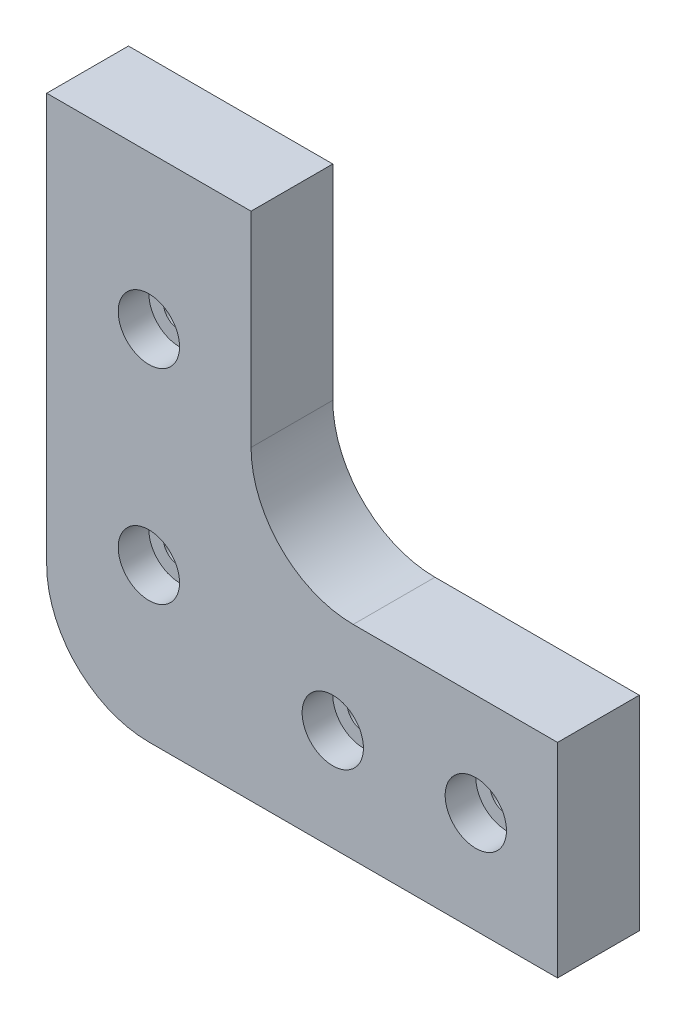
ISO-10303-21;
HEADER;
FILE_DESCRIPTION(('STEP AP214'),'2;1');
FILE_NAME('part.step','',(''),(''),'','','');
FILE_SCHEMA(('AUTOMOTIVE_DESIGN { 1 0 10303 214 1 1 1 1 }'));
ENDSEC;
DATA;
#1=APPLICATION_CONTEXT('core data for automotive mechanical design processes');
#2=APPLICATION_PROTOCOL_DEFINITION('international standard','automotive_design',2000,#1);
#3=PRODUCT_CONTEXT('',#1,'mechanical');
#4=PRODUCT('Part','Part','',(#3));
#5=PRODUCT_RELATED_PRODUCT_CATEGORY('part','',(#4));
#6=PRODUCT_DEFINITION_FORMATION('','',#4);
#7=PRODUCT_DEFINITION_CONTEXT('part definition',#1,'design');
#8=PRODUCT_DEFINITION('design','',#6,#7);
#9=PRODUCT_DEFINITION_SHAPE('','',#8);
#10=(LENGTH_UNIT() NAMED_UNIT(*) SI_UNIT(.MILLI.,.METRE.));
#11=(NAMED_UNIT(*) PLANE_ANGLE_UNIT() SI_UNIT($,.RADIAN.));
#12=(NAMED_UNIT(*) SI_UNIT($,.STERADIAN.) SOLID_ANGLE_UNIT());
#13=UNCERTAINTY_MEASURE_WITH_UNIT(LENGTH_MEASURE(1.E-05),#10,'distance_accuracy_value','');
#14=(GEOMETRIC_REPRESENTATION_CONTEXT(3) GLOBAL_UNCERTAINTY_ASSIGNED_CONTEXT((#13)) GLOBAL_UNIT_ASSIGNED_CONTEXT((#10,
#11,#12)) REPRESENTATION_CONTEXT('',''));
#15=CARTESIAN_POINT('',(0.,0.,0.));
#16=DIRECTION('',(0.,0.,1.));
#17=DIRECTION('',(1.,0.,0.));
#18=AXIS2_PLACEMENT_3D('',#15,#16,#17);
#19=CARTESIAN_POINT('',(0.,-125.,8.));
#20=DIRECTION('',(0.,0.,-1.));
#21=DIRECTION('',(-1.,0.,0.));
#22=AXIS2_PLACEMENT_3D('',#19,#20,#21);
#23=CYLINDRICAL_SURFACE('',#22,1.6);
#24=CARTESIAN_POINT('',(0.,-125.,0.));
#25=DIRECTION('',(0.,0.,1.));
#26=DIRECTION('',(1.,0.,0.));
#27=AXIS2_PLACEMENT_3D('',#24,#25,#26);
#28=CIRCLE('',#27,1.6);
#29=CARTESIAN_POINT('',(1.60000000000002,-125.,0.));
#30=VERTEX_POINT('',#29);
#31=EDGE_CURVE('E162',#30,#30,#28,.T.);
#32=ORIENTED_EDGE('',*,*,#31,.F.);
#33=EDGE_LOOP('',(#32));
#34=FACE_BOUND('',#33,.T.);
#35=CARTESIAN_POINT('',(0.,-125.,5.));
#36=DIRECTION('',(0.,0.,1.));
#37=DIRECTION('',(1.,0.,0.));
#38=AXIS2_PLACEMENT_3D('',#35,#36,#37);
#39=CIRCLE('',#38,1.6);
#40=CARTESIAN_POINT('',(1.60000000000002,-125.,5.));
#41=VERTEX_POINT('',#40);
#42=EDGE_CURVE('E200',#41,#41,#39,.T.);
#43=ORIENTED_EDGE('',*,*,#42,.T.);
#44=EDGE_LOOP('',(#43));
#45=FACE_BOUND('',#44,.T.);
#46=ADVANCED_FACE('F49',(#34,#45),#23,.F.);
#47=CARTESIAN_POINT('',(0.,-145.,8.));
#48=DIRECTION('',(0.,0.,-1.));
#49=DIRECTION('',(-1.,0.,0.));
#50=AXIS2_PLACEMENT_3D('',#47,#48,#49);
#51=CYLINDRICAL_SURFACE('',#50,1.59999999999999);
#52=CARTESIAN_POINT('',(0.,-145.,0.));
#53=DIRECTION('',(0.,0.,1.));
#54=DIRECTION('',(1.,0.,0.));
#55=AXIS2_PLACEMENT_3D('',#52,#53,#54);
#56=CIRCLE('',#55,1.59999999999999);
#57=CARTESIAN_POINT('',(1.60000000000001,-145.,0.));
#58=VERTEX_POINT('',#57);
#59=EDGE_CURVE('E510',#58,#58,#56,.T.);
#60=ORIENTED_EDGE('',*,*,#59,.F.);
#61=EDGE_LOOP('',(#60));
#62=FACE_BOUND('',#61,.T.);
#63=CARTESIAN_POINT('',(0.,-145.,5.));
#64=DIRECTION('',(0.,0.,1.));
#65=DIRECTION('',(1.,0.,0.));
#66=AXIS2_PLACEMENT_3D('',#63,#64,#65);
#67=CIRCLE('',#66,1.59999999999999);
#68=CARTESIAN_POINT('',(1.60000000000001,-145.,5.));
#69=VERTEX_POINT('',#68);
#70=EDGE_CURVE('E196',#69,#69,#67,.T.);
#71=ORIENTED_EDGE('',*,*,#70,.T.);
#72=EDGE_LOOP('',(#71));
#73=FACE_BOUND('',#72,.T.);
#74=ADVANCED_FACE('F248',(#62,#73),#51,.F.);
#75=CARTESIAN_POINT('',(18.,-150.014419513337,8.));
#76=DIRECTION('',(0.,0.,-1.));
#77=DIRECTION('',(-1.,0.,0.));
#78=AXIS2_PLACEMENT_3D('',#75,#76,#77);
#79=CYLINDRICAL_SURFACE('',#78,1.59999999999999);
#80=CARTESIAN_POINT('',(18.,-150.014419513337,0.));
#81=DIRECTION('',(0.,0.,1.));
#82=DIRECTION('',(1.,0.,0.));
#83=AXIS2_PLACEMENT_3D('',#80,#81,#82);
#84=CIRCLE('',#83,1.59999999999999);
#85=CARTESIAN_POINT('',(19.6,-150.014419513337,0.));
#86=VERTEX_POINT('',#85);
#87=EDGE_CURVE('E506',#86,#86,#84,.T.);
#88=ORIENTED_EDGE('',*,*,#87,.F.);
#89=EDGE_LOOP('',(#88));
#90=FACE_BOUND('',#89,.T.);
#91=CARTESIAN_POINT('',(18.,-150.014419513337,5.));
#92=DIRECTION('',(0.,0.,1.));
#93=DIRECTION('',(1.,0.,0.));
#94=AXIS2_PLACEMENT_3D('',#91,#92,#93);
#95=CIRCLE('',#94,1.59999999999999);
#96=CARTESIAN_POINT('',(19.6,-150.014419513337,5.));
#97=VERTEX_POINT('',#96);
#98=EDGE_CURVE('E191',#97,#97,#95,.T.);
#99=ORIENTED_EDGE('',*,*,#98,.T.);
#100=EDGE_LOOP('',(#99));
#101=FACE_BOUND('',#100,.T.);
#102=ADVANCED_FACE('F253',(#90,#101),#79,.F.);
#103=CARTESIAN_POINT('',(32.,-150.014419513337,8.));
#104=DIRECTION('',(0.,0.,-1.));
#105=DIRECTION('',(-1.,0.,0.));
#106=AXIS2_PLACEMENT_3D('',#103,#104,#105);
#107=CYLINDRICAL_SURFACE('',#106,1.6);
#108=CARTESIAN_POINT('',(32.,-150.014419513337,0.));
#109=DIRECTION('',(0.,0.,1.));
#110=DIRECTION('',(1.,0.,0.));
#111=AXIS2_PLACEMENT_3D('',#108,#109,#110);
#112=CIRCLE('',#111,1.6);
#113=CARTESIAN_POINT('',(33.6,-150.014419513337,0.));
#114=VERTEX_POINT('',#113);
#115=EDGE_CURVE('E204',#114,#114,#112,.T.);
#116=ORIENTED_EDGE('',*,*,#115,.F.);
#117=EDGE_LOOP('',(#116));
#118=FACE_BOUND('',#117,.T.);
#119=CARTESIAN_POINT('',(32.,-150.014419513337,5.));
#120=DIRECTION('',(0.,0.,1.));
#121=DIRECTION('',(1.,0.,0.));
#122=AXIS2_PLACEMENT_3D('',#119,#120,#121);
#123=CIRCLE('',#122,1.6);
#124=CARTESIAN_POINT('',(33.6,-150.014419513337,5.));
#125=VERTEX_POINT('',#124);
#126=EDGE_CURVE('E187',#125,#125,#123,.T.);
#127=ORIENTED_EDGE('',*,*,#126,.T.);
#128=EDGE_LOOP('',(#127));
#129=FACE_BOUND('',#128,.T.);
#130=ADVANCED_FACE('F262',(#118,#129),#107,.F.);
#131=CARTESIAN_POINT('',(0.,0.,8.));
#132=DIRECTION('',(0.,0.,1.));
#133=DIRECTION('',(1.,0.,0.));
#134=AXIS2_PLACEMENT_3D('',#131,#132,#133);
#135=PLANE('',#134);
#136=CARTESIAN_POINT('',(32.,-150.014419513337,8.));
#137=DIRECTION('',(0.,0.,1.));
#138=DIRECTION('',(1.,0.,0.));
#139=AXIS2_PLACEMENT_3D('',#136,#137,#138);
#140=CIRCLE('',#139,3.);
#141=CARTESIAN_POINT('',(35.,-150.014419513337,8.));
#142=VERTEX_POINT('',#141);
#143=EDGE_CURVE('E474',#142,#142,#140,.T.);
#144=ORIENTED_EDGE('',*,*,#143,.F.);
#145=EDGE_LOOP('',(#144));
#146=FACE_BOUND('',#145,.T.);
#147=CARTESIAN_POINT('',(18.,-150.014419513337,8.));
#148=DIRECTION('',(0.,0.,1.));
#149=DIRECTION('',(1.,0.,0.));
#150=AXIS2_PLACEMENT_3D('',#147,#148,#149);
#151=CIRCLE('',#150,3.);
#152=CARTESIAN_POINT('',(21.,-150.014419513337,8.));
#153=VERTEX_POINT('',#152);
#154=EDGE_CURVE('E479',#153,#153,#151,.T.);
#155=ORIENTED_EDGE('',*,*,#154,.F.);
#156=EDGE_LOOP('',(#155));
#157=FACE_BOUND('',#156,.T.);
#158=CARTESIAN_POINT('',(0.,-145.,8.));
#159=DIRECTION('',(0.,0.,1.));
#160=DIRECTION('',(1.,0.,0.));
#161=AXIS2_PLACEMENT_3D('',#158,#159,#160);
#162=CIRCLE('',#161,3.);
#163=CARTESIAN_POINT('',(3.00000000000002,-145.,8.));
#164=VERTEX_POINT('',#163);
#165=EDGE_CURVE('E489',#164,#164,#162,.T.);
#166=ORIENTED_EDGE('',*,*,#165,.F.);
#167=EDGE_LOOP('',(#166));
#168=FACE_BOUND('',#167,.T.);
#169=CARTESIAN_POINT('',(0.,-125.,8.));
#170=DIRECTION('',(0.,0.,1.));
#171=DIRECTION('',(1.,0.,0.));
#172=AXIS2_PLACEMENT_3D('',#169,#170,#171);
#173=CIRCLE('',#172,3.);
#174=CARTESIAN_POINT('',(3.00000000000002,-125.,8.));
#175=VERTEX_POINT('',#174);
#176=EDGE_CURVE('E497',#175,#175,#173,.T.);
#177=ORIENTED_EDGE('',*,*,#176,.F.);
#178=EDGE_LOOP('',(#177));
#179=FACE_BOUND('',#178,.T.);
#180=DIRECTION('',(0.,-1.,0.));
#181=VECTOR('',#180,1.);
#182=CARTESIAN_POINT('',(-9.99999999999999,-110.,8.));
#183=LINE('',#182,#181);
#184=CARTESIAN_POINT('',(-9.99999999999999,-110.,8.));
#185=VERTEX_POINT('',#184);
#186=CARTESIAN_POINT('',(-9.99999999999998,-150.,8.));
#187=VERTEX_POINT('',#186);
#188=EDGE_CURVE('E128',#185,#187,#183,.T.);
#189=ORIENTED_EDGE('',*,*,#188,.T.);
#190=CARTESIAN_POINT('',(0.,-150.,8.));
#191=DIRECTION('',(0.,0.,1.));
#192=DIRECTION('',(1.,0.,0.));
#193=AXIS2_PLACEMENT_3D('',#190,#191,#192);
#194=CIRCLE('',#193,10.);
#195=CARTESIAN_POINT('',(0.,-160.,8.));
#196=VERTEX_POINT('',#195);
#197=EDGE_CURVE('E123',#187,#196,#194,.T.);
#198=ORIENTED_EDGE('',*,*,#197,.T.);
#199=DIRECTION('',(1.,0.,0.));
#200=VECTOR('',#199,1.);
#201=CARTESIAN_POINT('',(-9.99999999999998,-160.,8.));
#202=LINE('',#201,#200);
#203=CARTESIAN_POINT('',(40.,-160.,8.));
#204=VERTEX_POINT('',#203);
#205=EDGE_CURVE('E115',#196,#204,#202,.T.);
#206=ORIENTED_EDGE('',*,*,#205,.T.);
#207=DIRECTION('',(0.,1.,0.));
#208=VECTOR('',#207,1.);
#209=CARTESIAN_POINT('',(40.,-160.,8.));
#210=LINE('',#209,#208);
#211=CARTESIAN_POINT('',(40.,-140.028839026674,8.));
#212=VERTEX_POINT('',#211);
#213=EDGE_CURVE('E120',#204,#212,#210,.T.);
#214=ORIENTED_EDGE('',*,*,#213,.T.);
#215=DIRECTION('',(-1.,0.,0.));
#216=VECTOR('',#215,1.);
#217=CARTESIAN_POINT('',(10.,-140.028839026674,8.));
#218=LINE('',#217,#216);
#219=CARTESIAN_POINT('',(20.,-140.028839026674,8.));
#220=VERTEX_POINT('',#219);
#221=EDGE_CURVE('E144',#212,#220,#218,.T.);
#222=ORIENTED_EDGE('',*,*,#221,.T.);
#223=CARTESIAN_POINT('',(20.,-130.028839026674,8.));
#224=DIRECTION('',(0.,0.,1.));
#225=DIRECTION('',(1.,0.,0.));
#226=AXIS2_PLACEMENT_3D('',#223,#224,#225);
#227=CIRCLE('',#226,10.);
#228=CARTESIAN_POINT('',(10.,-130.028839026674,8.));
#229=VERTEX_POINT('',#228);
#230=EDGE_CURVE('E11',#220,#229,#227,.F.);
#231=ORIENTED_EDGE('',*,*,#230,.T.);
#232=DIRECTION('',(0.,1.,0.));
#233=VECTOR('',#232,1.);
#234=CARTESIAN_POINT('',(10.,-110.,8.));
#235=LINE('',#234,#233);
#236=CARTESIAN_POINT('',(10.,-110.,8.));
#237=VERTEX_POINT('',#236);
#238=EDGE_CURVE('E149',#229,#237,#235,.T.);
#239=ORIENTED_EDGE('',*,*,#238,.T.);
#240=DIRECTION('',(-1.,0.,0.));
#241=VECTOR('',#240,1.);
#242=CARTESIAN_POINT('',(-9.99999999999999,-110.,8.));
#243=LINE('',#242,#241);
#244=EDGE_CURVE('E155',#237,#185,#243,.T.);
#245=ORIENTED_EDGE('',*,*,#244,.T.);
#246=EDGE_LOOP('',(#189,#198,#206,#214,#222,#231,#239,#245));
#247=FACE_BOUND('',#246,.T.);
#248=ADVANCED_FACE('F117',(#146,#157,#168,#179,#247),#135,.T.);
#249=CARTESIAN_POINT('',(0.,0.,0.));
#250=DIRECTION('',(0.,0.,1.));
#251=DIRECTION('',(1.,0.,0.));
#252=AXIS2_PLACEMENT_3D('',#249,#250,#251);
#253=PLANE('',#252);
#254=DIRECTION('',(1.,0.,0.));
#255=VECTOR('',#254,1.);
#256=CARTESIAN_POINT('',(-9.99999999999998,-160.,0.));
#257=LINE('',#256,#255);
#258=CARTESIAN_POINT('',(0.,-160.,0.));
#259=VERTEX_POINT('',#258);
#260=CARTESIAN_POINT('',(40.,-160.,0.));
#261=VERTEX_POINT('',#260);
#262=EDGE_CURVE('E133',#259,#261,#257,.T.);
#263=ORIENTED_EDGE('',*,*,#262,.F.);
#264=CARTESIAN_POINT('',(0.,-150.,0.));
#265=DIRECTION('',(0.,0.,1.));
#266=DIRECTION('',(1.,0.,0.));
#267=AXIS2_PLACEMENT_3D('',#264,#265,#266);
#268=CIRCLE('',#267,10.);
#269=CARTESIAN_POINT('',(-9.99999999999998,-150.,0.));
#270=VERTEX_POINT('',#269);
#271=EDGE_CURVE('E73',#259,#270,#268,.F.);
#272=ORIENTED_EDGE('',*,*,#271,.T.);
#273=DIRECTION('',(0.,-1.,0.));
#274=VECTOR('',#273,1.);
#275=CARTESIAN_POINT('',(-9.99999999999999,-110.,0.));
#276=LINE('',#275,#274);
#277=CARTESIAN_POINT('',(-9.99999999999999,-110.,0.));
#278=VERTEX_POINT('',#277);
#279=EDGE_CURVE('E159',#278,#270,#276,.T.);
#280=ORIENTED_EDGE('',*,*,#279,.F.);
#281=DIRECTION('',(-1.,0.,0.));
#282=VECTOR('',#281,1.);
#283=CARTESIAN_POINT('',(-9.99999999999999,-110.,0.));
#284=LINE('',#283,#282);
#285=CARTESIAN_POINT('',(10.,-110.,0.));
#286=VERTEX_POINT('',#285);
#287=EDGE_CURVE('E175',#286,#278,#284,.T.);
#288=ORIENTED_EDGE('',*,*,#287,.F.);
#289=DIRECTION('',(0.,1.,0.));
#290=VECTOR('',#289,1.);
#291=CARTESIAN_POINT('',(10.,-110.,0.));
#292=LINE('',#291,#290);
#293=CARTESIAN_POINT('',(10.,-130.028839026674,0.));
#294=VERTEX_POINT('',#293);
#295=EDGE_CURVE('E172',#294,#286,#292,.T.);
#296=ORIENTED_EDGE('',*,*,#295,.F.);
#297=CARTESIAN_POINT('',(20.,-130.028839026674,0.));
#298=DIRECTION('',(0.,0.,1.));
#299=DIRECTION('',(1.,0.,0.));
#300=AXIS2_PLACEMENT_3D('',#297,#298,#299);
#301=CIRCLE('',#300,10.);
#302=CARTESIAN_POINT('',(20.,-140.028839026674,0.));
#303=VERTEX_POINT('',#302);
#304=EDGE_CURVE('E58',#294,#303,#301,.T.);
#305=ORIENTED_EDGE('',*,*,#304,.T.);
#306=DIRECTION('',(-1.,0.,0.));
#307=VECTOR('',#306,1.);
#308=CARTESIAN_POINT('',(10.,-140.028839026674,0.));
#309=LINE('',#308,#307);
#310=CARTESIAN_POINT('',(40.,-140.028839026674,0.));
#311=VERTEX_POINT('',#310);
#312=EDGE_CURVE('E168',#311,#303,#309,.T.);
#313=ORIENTED_EDGE('',*,*,#312,.F.);
#314=DIRECTION('',(0.,1.,0.));
#315=VECTOR('',#314,1.);
#316=CARTESIAN_POINT('',(40.,-160.,0.));
#317=LINE('',#316,#315);
#318=EDGE_CURVE('E165',#261,#311,#317,.T.);
#319=ORIENTED_EDGE('',*,*,#318,.F.);
#320=EDGE_LOOP('',(#263,#272,#280,#288,#296,#305,#313,#319));
#321=FACE_BOUND('',#320,.T.);
#322=ORIENTED_EDGE('',*,*,#31,.T.);
#323=EDGE_LOOP('',(#322));
#324=FACE_BOUND('',#323,.T.);
#325=ORIENTED_EDGE('',*,*,#59,.T.);
#326=EDGE_LOOP('',(#325));
#327=FACE_BOUND('',#326,.T.);
#328=ORIENTED_EDGE('',*,*,#87,.T.);
#329=EDGE_LOOP('',(#328));
#330=FACE_BOUND('',#329,.T.);
#331=ORIENTED_EDGE('',*,*,#115,.T.);
#332=EDGE_LOOP('',(#331));
#333=FACE_BOUND('',#332,.T.);
#334=ADVANCED_FACE('F223',(#321,#324,#327,#330,#333),#253,.F.);
#335=CARTESIAN_POINT('',(-9.99999999999999,-110.,8.));
#336=DIRECTION('',(1.,0.,0.));
#337=DIRECTION('',(0.,1.,0.));
#338=AXIS2_PLACEMENT_3D('',#335,#336,#337);
#339=PLANE('',#338);
#340=ORIENTED_EDGE('',*,*,#279,.T.);
#341=DIRECTION('',(0.,0.,-1.));
#342=VECTOR('',#341,1.);
#343=CARTESIAN_POINT('',(-9.99999999999998,-150.,8.));
#344=LINE('',#343,#342);
#345=EDGE_CURVE('E65',#270,#187,#344,.F.);
#346=ORIENTED_EDGE('',*,*,#345,.T.);
#347=ORIENTED_EDGE('',*,*,#188,.F.);
#348=DIRECTION('',(0.,0.,-1.));
#349=VECTOR('',#348,1.);
#350=CARTESIAN_POINT('',(-9.99999999999999,-110.,8.));
#351=LINE('',#350,#349);
#352=EDGE_CURVE('E158',#185,#278,#351,.T.);
#353=ORIENTED_EDGE('',*,*,#352,.T.);
#354=EDGE_LOOP('',(#340,#346,#347,#353));
#355=FACE_BOUND('',#354,.T.);
#356=ADVANCED_FACE('F266',(#355),#339,.F.);
#357=CARTESIAN_POINT('',(-9.99999999999998,-160.,8.));
#358=DIRECTION('',(0.,1.,0.));
#359=DIRECTION('',(0.,0.,1.));
#360=AXIS2_PLACEMENT_3D('',#357,#358,#359);
#361=PLANE('',#360);
#362=ORIENTED_EDGE('',*,*,#205,.F.);
#363=DIRECTION('',(0.,0.,-1.));
#364=VECTOR('',#363,1.);
#365=CARTESIAN_POINT('',(0.,-160.,8.));
#366=LINE('',#365,#364);
#367=EDGE_CURVE('E211',#196,#259,#366,.T.);
#368=ORIENTED_EDGE('',*,*,#367,.T.);
#369=ORIENTED_EDGE('',*,*,#262,.T.);
#370=DIRECTION('',(0.,0.,-1.));
#371=VECTOR('',#370,1.);
#372=CARTESIAN_POINT('',(40.,-160.,8.));
#373=LINE('',#372,#371);
#374=EDGE_CURVE('E131',#204,#261,#373,.T.);
#375=ORIENTED_EDGE('',*,*,#374,.F.);
#376=EDGE_LOOP('',(#362,#368,#369,#375));
#377=FACE_BOUND('',#376,.T.);
#378=ADVANCED_FACE('F132',(#377),#361,.F.);
#379=CARTESIAN_POINT('',(40.,-160.,8.));
#380=DIRECTION('',(-1.,0.,0.));
#381=DIRECTION('',(0.,-1.,0.));
#382=AXIS2_PLACEMENT_3D('',#379,#380,#381);
#383=PLANE('',#382);
#384=ORIENTED_EDGE('',*,*,#318,.T.);
#385=DIRECTION('',(0.,0.,-1.));
#386=VECTOR('',#385,1.);
#387=CARTESIAN_POINT('',(40.,-140.028839026674,8.));
#388=LINE('',#387,#386);
#389=EDGE_CURVE('E138',#212,#311,#388,.T.);
#390=ORIENTED_EDGE('',*,*,#389,.F.);
#391=ORIENTED_EDGE('',*,*,#213,.F.);
#392=ORIENTED_EDGE('',*,*,#374,.T.);
#393=EDGE_LOOP('',(#384,#390,#391,#392));
#394=FACE_BOUND('',#393,.T.);
#395=ADVANCED_FACE('F140',(#394),#383,.F.);
#396=CARTESIAN_POINT('',(10.,-140.028839026674,8.));
#397=DIRECTION('',(0.,-1.,0.));
#398=DIRECTION('',(0.,0.,-1.));
#399=AXIS2_PLACEMENT_3D('',#396,#397,#398);
#400=PLANE('',#399);
#401=ORIENTED_EDGE('',*,*,#312,.T.);
#402=DIRECTION('',(0.,0.,-1.));
#403=VECTOR('',#402,1.);
#404=CARTESIAN_POINT('',(20.,-140.028839026674,8.));
#405=LINE('',#404,#403);
#406=EDGE_CURVE('E208',#303,#220,#405,.F.);
#407=ORIENTED_EDGE('',*,*,#406,.T.);
#408=ORIENTED_EDGE('',*,*,#221,.F.);
#409=ORIENTED_EDGE('',*,*,#389,.T.);
#410=EDGE_LOOP('',(#401,#407,#408,#409));
#411=FACE_BOUND('',#410,.T.);
#412=ADVANCED_FACE('F230',(#411),#400,.F.);
#413=CARTESIAN_POINT('',(10.,-110.,8.));
#414=DIRECTION('',(-1.,0.,0.));
#415=DIRECTION('',(0.,-1.,0.));
#416=AXIS2_PLACEMENT_3D('',#413,#414,#415);
#417=PLANE('',#416);
#418=ORIENTED_EDGE('',*,*,#238,.F.);
#419=DIRECTION('',(0.,0.,-1.));
#420=VECTOR('',#419,1.);
#421=CARTESIAN_POINT('',(10.,-130.028839026674,0.));
#422=LINE('',#421,#420);
#423=EDGE_CURVE('E137',#229,#294,#422,.T.);
#424=ORIENTED_EDGE('',*,*,#423,.T.);
#425=ORIENTED_EDGE('',*,*,#295,.T.);
#426=DIRECTION('',(0.,0.,-1.));
#427=VECTOR('',#426,1.);
#428=CARTESIAN_POINT('',(10.,-110.,8.));
#429=LINE('',#428,#427);
#430=EDGE_CURVE('E181',#237,#286,#429,.T.);
#431=ORIENTED_EDGE('',*,*,#430,.F.);
#432=EDGE_LOOP('',(#418,#424,#425,#431));
#433=FACE_BOUND('',#432,.T.);
#434=ADVANCED_FACE('F236',(#433),#417,.F.);
#435=CARTESIAN_POINT('',(-9.99999999999999,-110.,8.));
#436=DIRECTION('',(0.,-1.,0.));
#437=DIRECTION('',(0.,0.,-1.));
#438=AXIS2_PLACEMENT_3D('',#435,#436,#437);
#439=PLANE('',#438);
#440=ORIENTED_EDGE('',*,*,#287,.T.);
#441=ORIENTED_EDGE('',*,*,#352,.F.);
#442=ORIENTED_EDGE('',*,*,#244,.F.);
#443=ORIENTED_EDGE('',*,*,#430,.T.);
#444=EDGE_LOOP('',(#440,#441,#442,#443));
#445=FACE_BOUND('',#444,.T.);
#446=ADVANCED_FACE('F240',(#445),#439,.F.);
#447=CARTESIAN_POINT('',(32.,-150.014419513337,5.));
#448=DIRECTION('',(0.,0.,1.));
#449=DIRECTION('',(1.,0.,0.));
#450=AXIS2_PLACEMENT_3D('',#447,#448,#449);
#451=CYLINDRICAL_SURFACE('',#450,3.);
#452=CARTESIAN_POINT('',(32.,-150.014419513337,5.));
#453=DIRECTION('',(0.,0.,1.));
#454=DIRECTION('',(1.,0.,0.));
#455=AXIS2_PLACEMENT_3D('',#452,#453,#454);
#456=CIRCLE('',#455,3.);
#457=CARTESIAN_POINT('',(35.,-150.014419513337,5.));
#458=VERTEX_POINT('',#457);
#459=EDGE_CURVE('E192',#458,#458,#456,.T.);
#460=ORIENTED_EDGE('',*,*,#459,.F.);
#461=EDGE_LOOP('',(#460));
#462=FACE_BOUND('',#461,.T.);
#463=ORIENTED_EDGE('',*,*,#143,.T.);
#464=EDGE_LOOP('',(#463));
#465=FACE_BOUND('',#464,.T.);
#466=ADVANCED_FACE('F269',(#462,#465),#451,.F.);
#467=CARTESIAN_POINT('',(32.,-150.014419513337,5.));
#468=DIRECTION('',(0.,0.,1.));
#469=DIRECTION('',(1.,0.,0.));
#470=AXIS2_PLACEMENT_3D('',#467,#468,#469);
#471=PLANE('',#470);
#472=ORIENTED_EDGE('',*,*,#126,.F.);
#473=EDGE_LOOP('',(#472));
#474=FACE_BOUND('',#473,.T.);
#475=ORIENTED_EDGE('',*,*,#459,.T.);
#476=EDGE_LOOP('',(#475));
#477=FACE_BOUND('',#476,.T.);
#478=ADVANCED_FACE('F302',(#474,#477),#471,.T.);
#479=CARTESIAN_POINT('',(18.,-150.014419513337,5.));
#480=DIRECTION('',(0.,0.,1.));
#481=DIRECTION('',(1.,0.,0.));
#482=AXIS2_PLACEMENT_3D('',#479,#480,#481);
#483=CYLINDRICAL_SURFACE('',#482,3.);
#484=CARTESIAN_POINT('',(18.,-150.014419513337,5.));
#485=DIRECTION('',(0.,0.,1.));
#486=DIRECTION('',(1.,0.,0.));
#487=AXIS2_PLACEMENT_3D('',#484,#485,#486);
#488=CIRCLE('',#487,3.);
#489=CARTESIAN_POINT('',(21.,-150.014419513337,5.));
#490=VERTEX_POINT('',#489);
#491=EDGE_CURVE('E485',#490,#490,#488,.T.);
#492=ORIENTED_EDGE('',*,*,#491,.F.);
#493=EDGE_LOOP('',(#492));
#494=FACE_BOUND('',#493,.T.);
#495=ORIENTED_EDGE('',*,*,#154,.T.);
#496=EDGE_LOOP('',(#495));
#497=FACE_BOUND('',#496,.T.);
#498=ADVANCED_FACE('F310',(#494,#497),#483,.F.);
#499=CARTESIAN_POINT('',(18.,-150.014419513337,5.));
#500=DIRECTION('',(0.,0.,1.));
#501=DIRECTION('',(1.,0.,0.));
#502=AXIS2_PLACEMENT_3D('',#499,#500,#501);
#503=PLANE('',#502);
#504=ORIENTED_EDGE('',*,*,#98,.F.);
#505=EDGE_LOOP('',(#504));
#506=FACE_BOUND('',#505,.T.);
#507=ORIENTED_EDGE('',*,*,#491,.T.);
#508=EDGE_LOOP('',(#507));
#509=FACE_BOUND('',#508,.T.);
#510=ADVANCED_FACE('F317',(#506,#509),#503,.T.);
#511=CARTESIAN_POINT('',(0.,-145.,5.));
#512=DIRECTION('',(0.,0.,1.));
#513=DIRECTION('',(1.,0.,0.));
#514=AXIS2_PLACEMENT_3D('',#511,#512,#513);
#515=CYLINDRICAL_SURFACE('',#514,3.);
#516=CARTESIAN_POINT('',(0.,-145.,5.));
#517=DIRECTION('',(0.,0.,1.));
#518=DIRECTION('',(1.,0.,0.));
#519=AXIS2_PLACEMENT_3D('',#516,#517,#518);
#520=CIRCLE('',#519,3.);
#521=CARTESIAN_POINT('',(3.00000000000002,-145.,5.));
#522=VERTEX_POINT('',#521);
#523=EDGE_CURVE('E493',#522,#522,#520,.T.);
#524=ORIENTED_EDGE('',*,*,#523,.F.);
#525=EDGE_LOOP('',(#524));
#526=FACE_BOUND('',#525,.T.);
#527=ORIENTED_EDGE('',*,*,#165,.T.);
#528=EDGE_LOOP('',(#527));
#529=FACE_BOUND('',#528,.T.);
#530=ADVANCED_FACE('F324',(#526,#529),#515,.F.);
#531=CARTESIAN_POINT('',(0.,-145.,5.));
#532=DIRECTION('',(0.,0.,1.));
#533=DIRECTION('',(1.,0.,0.));
#534=AXIS2_PLACEMENT_3D('',#531,#532,#533);
#535=PLANE('',#534);
#536=ORIENTED_EDGE('',*,*,#70,.F.);
#537=EDGE_LOOP('',(#536));
#538=FACE_BOUND('',#537,.T.);
#539=ORIENTED_EDGE('',*,*,#523,.T.);
#540=EDGE_LOOP('',(#539));
#541=FACE_BOUND('',#540,.T.);
#542=ADVANCED_FACE('F331',(#538,#541),#535,.T.);
#543=CARTESIAN_POINT('',(0.,-125.,5.));
#544=DIRECTION('',(0.,0.,1.));
#545=DIRECTION('',(1.,0.,0.));
#546=AXIS2_PLACEMENT_3D('',#543,#544,#545);
#547=CYLINDRICAL_SURFACE('',#546,3.);
#548=CARTESIAN_POINT('',(0.,-125.,5.));
#549=DIRECTION('',(0.,0.,1.));
#550=DIRECTION('',(1.,0.,0.));
#551=AXIS2_PLACEMENT_3D('',#548,#549,#550);
#552=CIRCLE('',#551,3.);
#553=CARTESIAN_POINT('',(3.00000000000002,-125.,5.));
#554=VERTEX_POINT('',#553);
#555=EDGE_CURVE('E500',#554,#554,#552,.T.);
#556=ORIENTED_EDGE('',*,*,#555,.F.);
#557=EDGE_LOOP('',(#556));
#558=FACE_BOUND('',#557,.T.);
#559=ORIENTED_EDGE('',*,*,#176,.T.);
#560=EDGE_LOOP('',(#559));
#561=FACE_BOUND('',#560,.T.);
#562=ADVANCED_FACE('F338',(#558,#561),#547,.F.);
#563=CARTESIAN_POINT('',(0.,-125.,5.));
#564=DIRECTION('',(0.,0.,1.));
#565=DIRECTION('',(1.,0.,0.));
#566=AXIS2_PLACEMENT_3D('',#563,#564,#565);
#567=PLANE('',#566);
#568=ORIENTED_EDGE('',*,*,#42,.F.);
#569=EDGE_LOOP('',(#568));
#570=FACE_BOUND('',#569,.T.);
#571=ORIENTED_EDGE('',*,*,#555,.T.);
#572=EDGE_LOOP('',(#571));
#573=FACE_BOUND('',#572,.T.);
#574=ADVANCED_FACE('F246',(#570,#573),#567,.T.);
#575=CARTESIAN_POINT('',(20.,-130.028839026674,8.));
#576=DIRECTION('',(0.,0.,1.));
#577=DIRECTION('',(1.,0.,0.));
#578=AXIS2_PLACEMENT_3D('',#575,#576,#577);
#579=CYLINDRICAL_SURFACE('',#578,10.);
#580=ORIENTED_EDGE('',*,*,#230,.F.);
#581=ORIENTED_EDGE('',*,*,#406,.F.);
#582=ORIENTED_EDGE('',*,*,#304,.F.);
#583=ORIENTED_EDGE('',*,*,#423,.F.);
#584=EDGE_LOOP('',(#580,#581,#582,#583));
#585=FACE_BOUND('',#584,.T.);
#586=ADVANCED_FACE('F232',(#585),#579,.F.);
#587=CARTESIAN_POINT('',(0.,-150.,8.));
#588=DIRECTION('',(0.,0.,-1.));
#589=DIRECTION('',(-1.,0.,0.));
#590=AXIS2_PLACEMENT_3D('',#587,#588,#589);
#591=CYLINDRICAL_SURFACE('',#590,10.);
#592=ORIENTED_EDGE('',*,*,#197,.F.);
#593=ORIENTED_EDGE('',*,*,#345,.F.);
#594=ORIENTED_EDGE('',*,*,#271,.F.);
#595=ORIENTED_EDGE('',*,*,#367,.F.);
#596=EDGE_LOOP('',(#592,#593,#594,#595));
#597=FACE_BOUND('',#596,.T.);
#598=ADVANCED_FACE('F51',(#597),#591,.T.);
#599=CLOSED_SHELL('',(#46,#74,#102,#130,#248,#334,#356,#378,#395,#412,#434,#446,#466,#478,#498,
#510,#530,#542,#562,#574,#586,#598));
#600=MANIFOLD_SOLID_BREP('B2',#599);
#601=ADVANCED_BREP_SHAPE_REPRESENTATION('',(#18,#600),#14);
#602=SHAPE_DEFINITION_REPRESENTATION(#9,#601);
ENDSEC;
END-ISO-10303-21;
